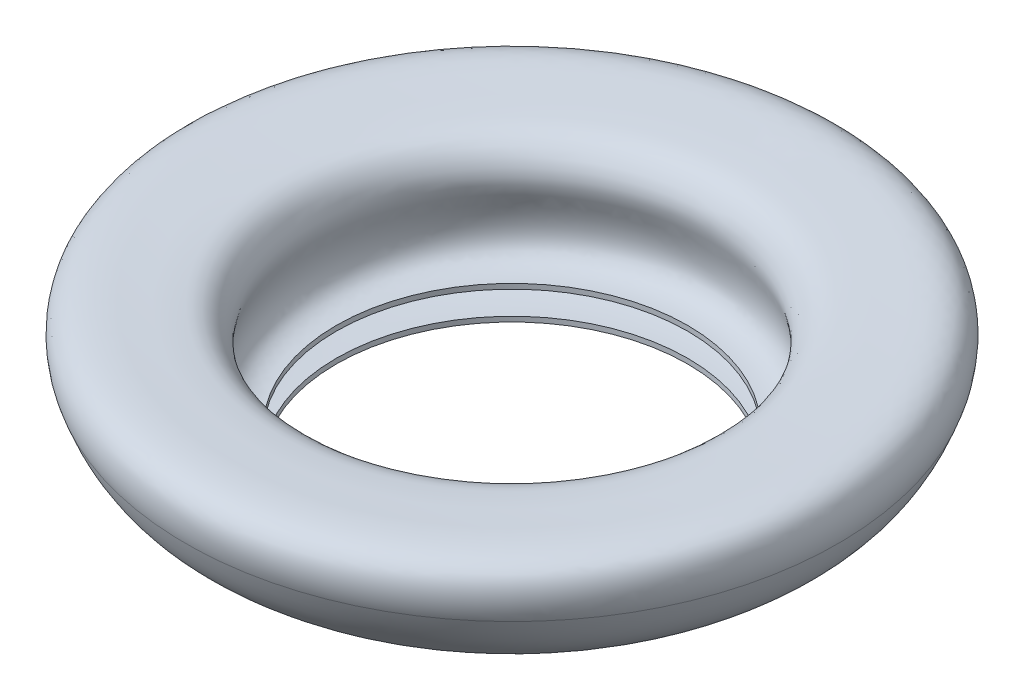
ISO-10303-21;
HEADER;
FILE_DESCRIPTION(('STEP AP214'),'2;1');
FILE_NAME('part.step','',(''),(''),'','','');
FILE_SCHEMA(('AUTOMOTIVE_DESIGN { 1 0 10303 214 1 1 1 1 }'));
ENDSEC;
DATA;
#1=APPLICATION_CONTEXT('core data for automotive mechanical design processes');
#2=APPLICATION_PROTOCOL_DEFINITION('international standard','automotive_design',2000,#1);
#3=PRODUCT_CONTEXT('',#1,'mechanical');
#4=PRODUCT('Part','Part','',(#3));
#5=PRODUCT_RELATED_PRODUCT_CATEGORY('part','',(#4));
#6=PRODUCT_DEFINITION_FORMATION('','',#4);
#7=PRODUCT_DEFINITION_CONTEXT('part definition',#1,'design');
#8=PRODUCT_DEFINITION('design','',#6,#7);
#9=PRODUCT_DEFINITION_SHAPE('','',#8);
#10=(LENGTH_UNIT() NAMED_UNIT(*) SI_UNIT(.MILLI.,.METRE.));
#11=(NAMED_UNIT(*) PLANE_ANGLE_UNIT() SI_UNIT($,.RADIAN.));
#12=(NAMED_UNIT(*) SI_UNIT($,.STERADIAN.) SOLID_ANGLE_UNIT());
#13=UNCERTAINTY_MEASURE_WITH_UNIT(LENGTH_MEASURE(1.E-05),#10,'distance_accuracy_value','');
#14=(GEOMETRIC_REPRESENTATION_CONTEXT(3) GLOBAL_UNCERTAINTY_ASSIGNED_CONTEXT((#13)) GLOBAL_UNIT_ASSIGNED_CONTEXT((#10,
#11,#12)) REPRESENTATION_CONTEXT('',''));
#15=CARTESIAN_POINT('',(0.,0.,0.));
#16=DIRECTION('',(0.,0.,1.));
#17=DIRECTION('',(1.,0.,0.));
#18=AXIS2_PLACEMENT_3D('',#15,#16,#17);
#19=CARTESIAN_POINT('',(-38.9786726814435,2.90953033318819,0.));
#20=CARTESIAN_POINT('',(-38.417351724798,1.38628262845185,0.));
#21=CARTESIAN_POINT('',(-36.532893353215,-2.86229628446064,0.));
#22=CARTESIAN_POINT('',(-29.585707761671,-6.42667693108054,0.));
#23=CARTESIAN_POINT('',(-24.2991213925257,-8.49999999999999,0.));
#24=CARTESIAN_POINT('',(-21.,-8.5,0.));
#25=B_SPLINE_CURVE_WITH_KNOTS('',3,(#19,#20,#21,#22,#23,#24),.UNSPECIFIED.,.F.,.F.,(4,1,1,4),
(0.,0.229620215211262,0.575400137310364,1.),.UNSPECIFIED.);
#26=CARTESIAN_POINT('',(0.,-24.0898556552338,0.));
#27=DIRECTION('',(0.,-1.,0.));
#28=AXIS1_PLACEMENT('',#26,#27);
#29=SURFACE_OF_REVOLUTION('',#25,#28);
#30=CARTESIAN_POINT('',(0.,-8.5,0.));
#31=DIRECTION('',(0.,-1.,0.));
#32=DIRECTION('',(0.,0.,-1.));
#33=AXIS2_PLACEMENT_3D('',#30,#31,#32);
#34=CIRCLE('',#33,21.);
#35=CARTESIAN_POINT('',(0.,-8.5,-21.));
#36=VERTEX_POINT('',#35);
#37=EDGE_CURVE('E10',#36,#36,#34,.T.);
#38=ORIENTED_EDGE('',*,*,#37,.F.);
#39=EDGE_LOOP('',(#38));
#40=FACE_BOUND('',#39,.T.);
#41=CARTESIAN_POINT('',(0.,2.90953033318819,0.));
#42=DIRECTION('',(0.,-1.,0.));
#43=DIRECTION('',(0.,0.,-1.));
#44=AXIS2_PLACEMENT_3D('',#41,#42,#43);
#45=CIRCLE('',#44,38.9786726814435);
#46=CARTESIAN_POINT('',(0.,2.90953033318819,-38.9786726814435));
#47=VERTEX_POINT('',#46);
#48=EDGE_CURVE('E54',#47,#47,#45,.T.);
#49=ORIENTED_EDGE('',*,*,#48,.T.);
#50=EDGE_LOOP('',(#49));
#51=FACE_BOUND('',#50,.T.);
#52=ADVANCED_FACE('F31',(#40,#51),#29,.T.);
#53=CARTESIAN_POINT('',(0.,-24.0898556552338,0.));
#54=DIRECTION('',(0.,-1.,0.));
#55=DIRECTION('',(0.,0.,-1.));
#56=AXIS2_PLACEMENT_3D('',#53,#54,#55);
#57=CYLINDRICAL_SURFACE('',#56,21.);
#58=CARTESIAN_POINT('',(0.,-7.9,0.));
#59=DIRECTION('',(0.,-1.,0.));
#60=DIRECTION('',(0.,0.,-1.));
#61=AXIS2_PLACEMENT_3D('',#58,#59,#60);
#62=CIRCLE('',#61,21.);
#63=CARTESIAN_POINT('',(0.,-7.9,-21.));
#64=VERTEX_POINT('',#63);
#65=EDGE_CURVE('E38',#64,#64,#62,.T.);
#66=ORIENTED_EDGE('',*,*,#65,.F.);
#67=EDGE_LOOP('',(#66));
#68=FACE_BOUND('',#67,.T.);
#69=ORIENTED_EDGE('',*,*,#37,.T.);
#70=EDGE_LOOP('',(#69));
#71=FACE_BOUND('',#70,.T.);
#72=ADVANCED_FACE('F83',(#68,#71),#57,.F.);
#73=CARTESIAN_POINT('',(-21.,-7.9,0.));
#74=CARTESIAN_POINT('',(-21.4585762631049,-7.9,0.));
#75=CARTESIAN_POINT('',(-22.3831096037236,-7.85261690303072,0.));
#76=CARTESIAN_POINT('',(-24.1595301773363,-7.58995601407165,0.));
#77=CARTESIAN_POINT('',(-26.3237680458941,-6.98849970427002,0.));
#78=CARTESIAN_POINT('',(-28.8703730863646,-5.94769961607768,0.));
#79=CARTESIAN_POINT('',(-31.4606043777514,-4.75825634891961,0.));
#80=CARTESIAN_POINT('',(-33.8867946944761,-3.40268661057232,0.));
#81=CARTESIAN_POINT('',(-35.5858314930377,-1.97954963876358,0.));
#82=CARTESIAN_POINT('',(-36.6626963739991,-0.572130657291732,0.));
#83=CARTESIAN_POINT('',(-37.3545649258312,0.619176976980203,0.));
#84=CARTESIAN_POINT('',(-37.9410548207538,1.87927755007968,0.));
#85=CARTESIAN_POINT('',(-38.2616101973016,2.69889258272875,0.));
#86=CARTESIAN_POINT('',(-38.415681731723,3.1169940421419,0.));
#87=B_SPLINE_CURVE_WITH_KNOTS('',3,(#73,#74,#75,#76,#77,#78,#79,#80,#81,#82,#83,#84,#85,#86),
.UNSPECIFIED.,.F.,.F.,(4,1,1,1,1,1,1,1,1,1,1,4),(0.,0.0625,0.125,0.25,0.375,0.5,0.625,0.75,
0.8125,0.875,0.9375,1.),.UNSPECIFIED.);
#88=CARTESIAN_POINT('',(0.,-24.0898556552338,0.));
#89=DIRECTION('',(0.,-1.,0.));
#90=AXIS1_PLACEMENT('',#88,#89);
#91=SURFACE_OF_REVOLUTION('',#87,#90);
#92=CARTESIAN_POINT('',(0.,3.1169940421419,0.));
#93=DIRECTION('',(0.,-1.,0.));
#94=DIRECTION('',(0.,0.,-1.));
#95=AXIS2_PLACEMENT_3D('',#92,#93,#94);
#96=CIRCLE('',#95,38.415681731723);
#97=CARTESIAN_POINT('',(0.,3.1169940421419,-38.415681731723));
#98=VERTEX_POINT('',#97);
#99=EDGE_CURVE('E42',#98,#98,#96,.T.);
#100=ORIENTED_EDGE('',*,*,#99,.F.);
#101=EDGE_LOOP('',(#100));
#102=FACE_BOUND('',#101,.T.);
#103=ORIENTED_EDGE('',*,*,#65,.T.);
#104=EDGE_LOOP('',(#103));
#105=FACE_BOUND('',#104,.T.);
#106=ADVANCED_FACE('F80',(#102,#105),#91,.T.);
#107=CARTESIAN_POINT('',(-38.415681731723,3.11699404214189,0.));
#108=CARTESIAN_POINT('',(-38.5424843237606,3.4610962086282,0.));
#109=CARTESIAN_POINT('',(-38.73879117557,4.19440510383903,0.));
#110=CARTESIAN_POINT('',(-38.8347052241671,5.54042402362122,0.));
#111=CARTESIAN_POINT('',(-38.4631123481763,6.9357616486423,0.));
#112=CARTESIAN_POINT('',(-37.5100656205664,7.74138208628656,0.));
#113=CARTESIAN_POINT('',(-35.80745244529,8.11579969893834,0.));
#114=CARTESIAN_POINT('',(-33.604590850156,8.06780274365279,0.));
#115=CARTESIAN_POINT('',(-31.600178696441,7.88683420005728,0.));
#116=CARTESIAN_POINT('',(-29.993818573642,7.78863154129765,0.));
#117=CARTESIAN_POINT('',(-28.4749963773106,7.75838081513584,0.));
#118=CARTESIAN_POINT('',(-26.8210164690813,7.64684185202098,0.));
#119=CARTESIAN_POINT('',(-25.6359453229049,7.12408462509003,0.));
#120=CARTESIAN_POINT('',(-24.8271802724831,6.21577665320839,0.));
#121=CARTESIAN_POINT('',(-24.3738560339924,5.37790819520976,0.));
#122=CARTESIAN_POINT('',(-24.1477605032414,4.51251912288677,0.));
#123=CARTESIAN_POINT('',(-24.1926636835898,3.42901094216555,0.));
#124=CARTESIAN_POINT('',(-24.7653523916571,1.84963414007884,0.));
#125=CARTESIAN_POINT('',(-25.3494376547074,-0.429410502603739,0.));
#126=CARTESIAN_POINT('',(-25.3057325254663,-2.31495219177231,0.));
#127=CARTESIAN_POINT('',(-24.6697629547137,-3.67050007262378,0.));
#128=CARTESIAN_POINT('',(-23.8128587946968,-4.48659636264573,0.));
#129=CARTESIAN_POINT('',(-22.8009870407531,-4.90389412356495,0.));
#130=CARTESIAN_POINT('',(-21.8404593181577,-5.07158626841788,0.));
#131=CARTESIAN_POINT('',(-21.273273089675,-5.1,0.));
#132=CARTESIAN_POINT('',(-21.,-5.1,0.));
#133=B_SPLINE_CURVE_WITH_KNOTS('',3,(#107,#108,#109,#110,#111,#112,#113,#114,#115,#116,#117,
#118,#119,#120,#121,#122,#123,#124,#125,#126,#127,#128,#129,#130,#131,#132),.UNSPECIFIED.,.F.,
.F.,(4,1,1,1,1,1,1,1,1,1,1,1,1,1,1,1,1,1,1,1,1,1,1,4),(0.,0.03125,0.0625,0.125,0.1875,0.25,
0.3125,0.375,0.40625,0.4375,0.5,0.5625,0.59375,0.625,0.65625,0.6875,0.75,0.8125,0.875,0.90625,
0.9375,0.96875,0.984375,1.),.UNSPECIFIED.);
#134=CARTESIAN_POINT('',(0.,-24.0898556552338,0.));
#135=DIRECTION('',(0.,-1.,0.));
#136=AXIS1_PLACEMENT('',#134,#135);
#137=SURFACE_OF_REVOLUTION('',#133,#136);
#138=CARTESIAN_POINT('',(0.,-5.1,0.));
#139=DIRECTION('',(0.,-1.,0.));
#140=DIRECTION('',(0.,0.,-1.));
#141=AXIS2_PLACEMENT_3D('',#138,#139,#140);
#142=CIRCLE('',#141,21.);
#143=CARTESIAN_POINT('',(0.,-5.1,-21.));
#144=VERTEX_POINT('',#143);
#145=EDGE_CURVE('E46',#144,#144,#142,.T.);
#146=ORIENTED_EDGE('',*,*,#145,.F.);
#147=EDGE_LOOP('',(#146));
#148=FACE_BOUND('',#147,.T.);
#149=ORIENTED_EDGE('',*,*,#99,.T.);
#150=EDGE_LOOP('',(#149));
#151=FACE_BOUND('',#150,.T.);
#152=ADVANCED_FACE('F76',(#148,#151),#137,.T.);
#153=CARTESIAN_POINT('',(0.,-24.0898556552338,0.));
#154=DIRECTION('',(0.,-1.,0.));
#155=DIRECTION('',(0.,0.,-1.));
#156=AXIS2_PLACEMENT_3D('',#153,#154,#155);
#157=CYLINDRICAL_SURFACE('',#156,21.);
#158=CARTESIAN_POINT('',(0.,-4.5,0.));
#159=DIRECTION('',(0.,-1.,0.));
#160=DIRECTION('',(0.,0.,-1.));
#161=AXIS2_PLACEMENT_3D('',#158,#159,#160);
#162=CIRCLE('',#161,21.);
#163=CARTESIAN_POINT('',(0.,-4.5,-21.));
#164=VERTEX_POINT('',#163);
#165=EDGE_CURVE('E51',#164,#164,#162,.T.);
#166=ORIENTED_EDGE('',*,*,#165,.F.);
#167=EDGE_LOOP('',(#166));
#168=FACE_BOUND('',#167,.T.);
#169=ORIENTED_EDGE('',*,*,#145,.T.);
#170=EDGE_LOOP('',(#169));
#171=FACE_BOUND('',#170,.T.);
#172=ADVANCED_FACE('F72',(#168,#171),#157,.F.);
#173=CARTESIAN_POINT('',(-21.,-4.5,0.));
#174=CARTESIAN_POINT('',(-25.1666763486585,-4.49999999999998,0.));
#175=CARTESIAN_POINT('',(-24.9998815654921,-0.0228908272984037,0.));
#176=CARTESIAN_POINT('',(-23.039745828945,4.48472747102207,0.));
#177=CARTESIAN_POINT('',(-25.3480580449223,8.52372000212266,0.));
#178=CARTESIAN_POINT('',(-31.2065921048384,8.10462668018741,0.));
#179=CARTESIAN_POINT('',(-39.2077194755908,9.72223211970493,0.));
#180=CARTESIAN_POINT('',(-39.6125286576096,4.62961516059012,0.));
#181=CARTESIAN_POINT('',(-38.9786726814435,2.90953033318819,0.));
#182=B_SPLINE_CURVE_WITH_KNOTS('',3,(#173,#174,#175,#176,#177,#178,#179,#180,#181),
.UNSPECIFIED.,.F.,.F.,(4,1,1,1,1,1,4),(0.,0.242242525499384,0.340661927684987,0.444265623040726,
0.5982174241015,0.862644115315211,1.),.UNSPECIFIED.);
#183=CARTESIAN_POINT('',(0.,-24.0898556552338,0.));
#184=DIRECTION('',(0.,-1.,0.));
#185=AXIS1_PLACEMENT('',#183,#184);
#186=SURFACE_OF_REVOLUTION('',#182,#185);
#187=ORIENTED_EDGE('',*,*,#48,.F.);
#188=EDGE_LOOP('',(#187));
#189=FACE_BOUND('',#188,.T.);
#190=ORIENTED_EDGE('',*,*,#165,.T.);
#191=EDGE_LOOP('',(#190));
#192=FACE_BOUND('',#191,.T.);
#193=ADVANCED_FACE('F69',(#189,#192),#186,.T.);
#194=CLOSED_SHELL('',(#52,#72,#106,#152,#172,#193));
#195=MANIFOLD_SOLID_BREP('B2',#194);
#196=ADVANCED_BREP_SHAPE_REPRESENTATION('',(#18,#195),#14);
#197=SHAPE_DEFINITION_REPRESENTATION(#9,#196);
ENDSEC;
END-ISO-10303-21;
